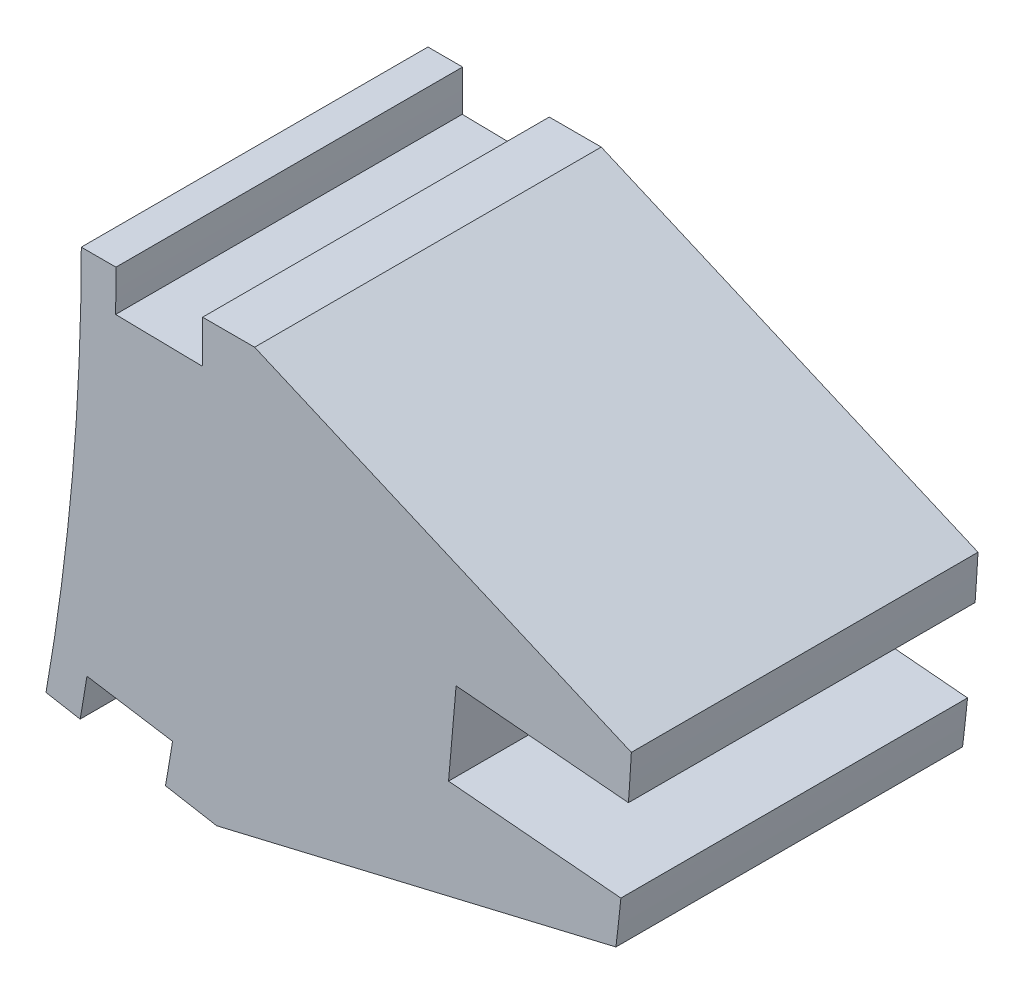
ISO-10303-21;
HEADER;
FILE_DESCRIPTION(('STEP AP214'),'2;1');
FILE_NAME('part.step','',(''),(''),'','','');
FILE_SCHEMA(('AUTOMOTIVE_DESIGN { 1 0 10303 214 1 1 1 1 }'));
ENDSEC;
DATA;
#1=APPLICATION_CONTEXT('core data for automotive mechanical design processes');
#2=APPLICATION_PROTOCOL_DEFINITION('international standard','automotive_design',2000,#1);
#3=PRODUCT_CONTEXT('',#1,'mechanical');
#4=PRODUCT('Part','Part','',(#3));
#5=PRODUCT_RELATED_PRODUCT_CATEGORY('part','',(#4));
#6=PRODUCT_DEFINITION_FORMATION('','',#4);
#7=PRODUCT_DEFINITION_CONTEXT('part definition',#1,'design');
#8=PRODUCT_DEFINITION('design','',#6,#7);
#9=PRODUCT_DEFINITION_SHAPE('','',#8);
#10=(LENGTH_UNIT() NAMED_UNIT(*) SI_UNIT(.MILLI.,.METRE.));
#11=(NAMED_UNIT(*) PLANE_ANGLE_UNIT() SI_UNIT($,.RADIAN.));
#12=(NAMED_UNIT(*) SI_UNIT($,.STERADIAN.) SOLID_ANGLE_UNIT());
#13=UNCERTAINTY_MEASURE_WITH_UNIT(LENGTH_MEASURE(1.E-05),#10,'distance_accuracy_value','');
#14=(GEOMETRIC_REPRESENTATION_CONTEXT(3) GLOBAL_UNCERTAINTY_ASSIGNED_CONTEXT((#13)) GLOBAL_UNIT_ASSIGNED_CONTEXT((#10,
#11,#12)) REPRESENTATION_CONTEXT('',''));
#15=CARTESIAN_POINT('',(0.,0.,0.));
#16=DIRECTION('',(0.,0.,1.));
#17=DIRECTION('',(1.,0.,0.));
#18=AXIS2_PLACEMENT_3D('',#15,#16,#17);
#19=CARTESIAN_POINT('',(670.,0.,100.));
#20=DIRECTION('',(0.,-1.,0.));
#21=DIRECTION('',(0.,0.,-1.));
#22=AXIS2_PLACEMENT_3D('',#19,#20,#21);
#23=PLANE('',#22);
#24=DIRECTION('',(0.,0.,1.));
#25=VECTOR('',#24,1.);
#26=CARTESIAN_POINT('',(720.,0.,-0.001000000000001));
#27=LINE('',#26,#25);
#28=CARTESIAN_POINT('',(720.,0.,0.));
#29=VERTEX_POINT('',#28);
#30=CARTESIAN_POINT('',(720.,0.,100.));
#31=VERTEX_POINT('',#30);
#32=EDGE_CURVE('E161',#29,#31,#27,.T.);
#33=ORIENTED_EDGE('',*,*,#32,.F.);
#34=DIRECTION('',(-1.,0.,0.));
#35=VECTOR('',#34,1.);
#36=CARTESIAN_POINT('',(670.,0.,0.));
#37=LINE('',#36,#35);
#38=CARTESIAN_POINT('',(705.,0.,0.));
#39=VERTEX_POINT('',#38);
#40=EDGE_CURVE('E203',#29,#39,#37,.T.);
#41=ORIENTED_EDGE('',*,*,#40,.T.);
#42=DIRECTION('',(0.,0.,-1.));
#43=VECTOR('',#42,1.);
#44=CARTESIAN_POINT('',(705.,0.,100.));
#45=LINE('',#44,#43);
#46=CARTESIAN_POINT('',(705.,0.,100.));
#47=VERTEX_POINT('',#46);
#48=EDGE_CURVE('E260',#47,#39,#45,.T.);
#49=ORIENTED_EDGE('',*,*,#48,.F.);
#50=DIRECTION('',(-1.,0.,0.));
#51=VECTOR('',#50,1.);
#52=CARTESIAN_POINT('',(670.,0.,100.));
#53=LINE('',#52,#51);
#54=EDGE_CURVE('E190',#31,#47,#53,.T.);
#55=ORIENTED_EDGE('',*,*,#54,.F.);
#56=EDGE_LOOP('',(#33,#41,#49,#55));
#57=FACE_BOUND('',#56,.T.);
#58=ADVANCED_FACE('F35',(#57),#23,.F.);
#59=CARTESIAN_POINT('',(0.,0.,100.));
#60=DIRECTION('',(0.,0.,-1.));
#61=DIRECTION('',(-1.,0.,0.));
#62=AXIS2_PLACEMENT_3D('',#59,#60,#61);
#63=CYLINDRICAL_SURFACE('',#62,830.);
#64=DIRECTION('',(0.,0.,1.));
#65=VECTOR('',#64,1.);
#66=CARTESIAN_POINT('',(828.675083599336,-46.8786286236421,-0.001000000000001));
#67=LINE('',#66,#65);
#68=CARTESIAN_POINT('',(828.675083599336,-46.8786286236421,0.));
#69=VERTEX_POINT('',#68);
#70=CARTESIAN_POINT('',(828.675083599336,-46.8786286236421,100.));
#71=VERTEX_POINT('',#70);
#72=EDGE_CURVE('E50',#69,#71,#67,.T.);
#73=ORIENTED_EDGE('',*,*,#72,.T.);
#74=CARTESIAN_POINT('',(0.,0.,100.));
#75=DIRECTION('',(0.,0.,1.));
#76=DIRECTION('',(1.,0.,0.));
#77=AXIS2_PLACEMENT_3D('',#74,#75,#76);
#78=CIRCLE('',#77,830.);
#79=CARTESIAN_POINT('',(827.837272556722,-59.8786286236421,100.));
#80=VERTEX_POINT('',#79);
#81=EDGE_CURVE('E172',#80,#71,#78,.T.);
#82=ORIENTED_EDGE('',*,*,#81,.F.);
#83=DIRECTION('',(0.,0.,1.));
#84=VECTOR('',#83,1.);
#85=CARTESIAN_POINT('',(827.837272556722,-59.8786286236421,0.));
#86=LINE('',#85,#84);
#87=CARTESIAN_POINT('',(827.837272556722,-59.8786286236421,0.));
#88=VERTEX_POINT('',#87);
#89=EDGE_CURVE('E236',#88,#80,#86,.T.);
#90=ORIENTED_EDGE('',*,*,#89,.F.);
#91=CARTESIAN_POINT('',(0.,0.,0.));
#92=DIRECTION('',(0.,0.,1.));
#93=DIRECTION('',(1.,0.,0.));
#94=AXIS2_PLACEMENT_3D('',#91,#92,#93);
#95=CIRCLE('',#94,830.);
#96=EDGE_CURVE('E174',#88,#69,#95,.T.);
#97=ORIENTED_EDGE('',*,*,#96,.T.);
#98=EDGE_LOOP('',(#73,#82,#90,#97));
#99=FACE_BOUND('',#98,.T.);
#100=ADVANCED_FACE('F170',(#99),#63,.T.);
#101=CARTESIAN_POINT('',(0.,0.,100.));
#102=DIRECTION('',(0.,0.,1.));
#103=DIRECTION('',(1.,0.,0.));
#104=AXIS2_PLACEMENT_3D('',#101,#102,#103);
#105=PLANE('',#104);
#106=ORIENTED_EDGE('',*,*,#81,.T.);
#107=DIRECTION('',(-0.918213730200936,0.396085275755718,0.));
#108=VECTOR('',#107,1.);
#109=CARTESIAN_POINT('',(112.956152882748,261.857475741113,100.));
#110=LINE('',#109,#108);
#111=EDGE_CURVE('E158',#71,#31,#110,.T.);
#112=ORIENTED_EDGE('',*,*,#111,.T.);
#113=ORIENTED_EDGE('',*,*,#54,.T.);
#114=CARTESIAN_POINT('',(0.,0.,100.));
#115=DIRECTION('',(0.,0.,-1.));
#116=DIRECTION('',(-1.,0.,0.));
#117=AXIS2_PLACEMENT_3D('',#114,#115,#116);
#118=CIRCLE('',#117,705.);
#119=CARTESIAN_POINT('',(704.892625085256,-12.3039465382994,100.));
#120=VERTEX_POINT('',#119);
#121=EDGE_CURVE('E257',#120,#47,#118,.F.);
#122=ORIENTED_EDGE('',*,*,#121,.F.);
#123=DIRECTION('',(0.999847695156391,-0.0174524064373041,0.));
#124=VECTOR('',#123,1.);
#125=CARTESIAN_POINT('',(0.,0.,100.));
#126=LINE('',#125,#124);
#127=CARTESIAN_POINT('',(679.896432706346,-11.8676363773668,100.));
#128=VERTEX_POINT('',#127);
#129=EDGE_CURVE('E270',#128,#120,#126,.T.);
#130=ORIENTED_EDGE('',*,*,#129,.F.);
#131=CARTESIAN_POINT('',(0.,0.,100.));
#132=DIRECTION('',(0.,0.,-1.));
#133=DIRECTION('',(-1.,0.,0.));
#134=AXIS2_PLACEMENT_3D('',#131,#132,#133);
#135=CIRCLE('',#134,680.);
#136=CARTESIAN_POINT('',(680.,0.,100.));
#137=VERTEX_POINT('',#136);
#138=EDGE_CURVE('E278',#128,#137,#135,.F.);
#139=ORIENTED_EDGE('',*,*,#138,.T.);
#140=CARTESIAN_POINT('',(670.,0.,100.));
#141=VERTEX_POINT('',#140);
#142=EDGE_CURVE('E184',#137,#141,#53,.T.);
#143=ORIENTED_EDGE('',*,*,#142,.T.);
#144=CARTESIAN_POINT('',(0.,0.,100.));
#145=DIRECTION('',(0.,0.,-1.));
#146=DIRECTION('',(1.,0.,0.));
#147=AXIS2_PLACEMENT_3D('',#144,#145,#146);
#148=CIRCLE('',#147,670.);
#149=CARTESIAN_POINT('',(659.821194518179,-116.344279036844,100.));
#150=VERTEX_POINT('',#149);
#151=EDGE_CURVE('E204',#141,#150,#148,.T.);
#152=ORIENTED_EDGE('',*,*,#151,.T.);
#153=DIRECTION('',(0.984807753012208,-0.173648177666931,0.));
#154=VECTOR('',#153,1.);
#155=CARTESIAN_POINT('',(659.821194518179,-116.344279036844,100.));
#156=LINE('',#155,#154);
#157=CARTESIAN_POINT('',(669.669272048302,-118.080760813513,100.));
#158=VERTEX_POINT('',#157);
#159=EDGE_CURVE('E182',#150,#158,#156,.T.);
#160=ORIENTED_EDGE('',*,*,#159,.T.);
#161=CARTESIAN_POINT('',(0.,0.,100.));
#162=DIRECTION('',(0.,0.,-1.));
#163=DIRECTION('',(-1.,0.,0.));
#164=AXIS2_PLACEMENT_3D('',#161,#162,#163);
#165=CIRCLE('',#164,680.);
#166=CARTESIAN_POINT('',(671.628071604693,-106.375436227344,100.));
#167=VERTEX_POINT('',#166);
#168=EDGE_CURVE('E284',#167,#158,#165,.T.);
#169=ORIENTED_EDGE('',*,*,#168,.F.);
#170=DIRECTION('',(0.987688340595141,-0.156434465040212,0.));
#171=VECTOR('',#170,1.);
#172=CARTESIAN_POINT('',(0.,0.,100.));
#173=LINE('',#172,#171);
#174=CARTESIAN_POINT('',(696.320280119572,-110.286297853349,100.));
#175=VERTEX_POINT('',#174);
#176=EDGE_CURVE('E290',#167,#175,#173,.T.);
#177=ORIENTED_EDGE('',*,*,#176,.T.);
#178=CARTESIAN_POINT('',(0.,0.,100.));
#179=DIRECTION('',(0.,0.,-1.));
#180=DIRECTION('',(-1.,0.,0.));
#181=AXIS2_PLACEMENT_3D('',#178,#179,#180);
#182=CIRCLE('',#181,705.);
#183=CARTESIAN_POINT('',(694.289465873607,-122.421965255186,100.));
#184=VERTEX_POINT('',#183);
#185=EDGE_CURVE('E296',#175,#184,#182,.T.);
#186=ORIENTED_EDGE('',*,*,#185,.T.);
#187=CARTESIAN_POINT('',(709.06158216879,-125.02668792019,100.));
#188=VERTEX_POINT('',#187);
#189=EDGE_CURVE('E186',#184,#188,#156,.T.);
#190=ORIENTED_EDGE('',*,*,#189,.T.);
#191=DIRECTION('',(-0.973043486759826,-0.230621709460062,0.));
#192=VECTOR('',#191,1.);
#193=CARTESIAN_POINT('',(65.7690216384555,-277.493902398411,100.));
#194=LINE('',#193,#192);
#195=CARTESIAN_POINT('',(824.226035488686,-97.7314812258738,100.));
#196=VERTEX_POINT('',#195);
#197=EDGE_CURVE('E305',#196,#188,#194,.T.);
#198=ORIENTED_EDGE('',*,*,#197,.F.);
#199=CARTESIAN_POINT('',(825.65837898803,-84.7834960759358,100.));
#200=VERTEX_POINT('',#199);
#201=EDGE_CURVE('E181',#196,#200,#78,.T.);
#202=ORIENTED_EDGE('',*,*,#201,.T.);
#203=DIRECTION('',(0.996194698091746,-0.0871557427476585,0.));
#204=VECTOR('',#203,1.);
#205=CARTESIAN_POINT('',(-1.08944678434574,-12.4524337261469,100.));
#206=LINE('',#205,#204);
#207=CARTESIAN_POINT('',(775.942417727216,-80.4339130693205,100.));
#208=VERTEX_POINT('',#207);
#209=EDGE_CURVE('E241',#208,#200,#206,.T.);
#210=ORIENTED_EDGE('',*,*,#209,.F.);
#211=DIRECTION('',(-0.0871557427476599,-0.996194698091746,0.));
#212=VECTOR('',#211,1.);
#213=CARTESIAN_POINT('',(777.031864511561,-67.9814793431747,100.));
#214=LINE('',#213,#212);
#215=CARTESIAN_POINT('',(778.121311295907,-55.5290456170269,100.));
#216=VERTEX_POINT('',#215);
#217=EDGE_CURVE('E244',#216,#208,#214,.T.);
#218=ORIENTED_EDGE('',*,*,#217,.F.);
#219=DIRECTION('',(0.996194698091746,-0.0871557427476581,0.));
#220=VECTOR('',#219,1.);
#221=CARTESIAN_POINT('',(1.08944678434569,12.4524337261465,100.));
#222=LINE('',#221,#220);
#223=EDGE_CURVE('E180',#216,#80,#222,.T.);
#224=ORIENTED_EDGE('',*,*,#223,.T.);
#225=EDGE_LOOP('',(#106,#112,#113,#122,#130,#139,#143,#152,#160,#169,#177,#186,#190,#198,#202,
#210,#218,#224));
#226=FACE_BOUND('',#225,.T.);
#227=ADVANCED_FACE('F177',(#226),#105,.T.);
#228=CARTESIAN_POINT('',(0.,0.,0.));
#229=DIRECTION('',(0.,0.,1.));
#230=DIRECTION('',(1.,0.,0.));
#231=AXIS2_PLACEMENT_3D('',#228,#229,#230);
#232=PLANE('',#231);
#233=DIRECTION('',(0.918213730200936,-0.396085275755718,0.));
#234=VECTOR('',#233,1.);
#235=CARTESIAN_POINT('',(112.956152882748,261.857475741113,0.));
#236=LINE('',#235,#234);
#237=EDGE_CURVE('E165',#29,#69,#236,.T.);
#238=ORIENTED_EDGE('',*,*,#237,.T.);
#239=ORIENTED_EDGE('',*,*,#96,.F.);
#240=DIRECTION('',(0.996194698091746,-0.0871557427476581,0.));
#241=VECTOR('',#240,1.);
#242=CARTESIAN_POINT('',(1.08944678434569,12.4524337261465,0.));
#243=LINE('',#242,#241);
#244=CARTESIAN_POINT('',(778.121311295907,-55.5290456170269,0.));
#245=VERTEX_POINT('',#244);
#246=EDGE_CURVE('E233',#245,#88,#243,.T.);
#247=ORIENTED_EDGE('',*,*,#246,.F.);
#248=DIRECTION('',(-0.0871557427476599,-0.996194698091746,0.));
#249=VECTOR('',#248,1.);
#250=CARTESIAN_POINT('',(777.031864511561,-67.9814793431747,0.));
#251=LINE('',#250,#249);
#252=CARTESIAN_POINT('',(775.942417727216,-80.4339130693205,0.));
#253=VERTEX_POINT('',#252);
#254=EDGE_CURVE('E240',#245,#253,#251,.T.);
#255=ORIENTED_EDGE('',*,*,#254,.T.);
#256=DIRECTION('',(0.996194698091746,-0.0871557427476585,0.));
#257=VECTOR('',#256,1.);
#258=CARTESIAN_POINT('',(-1.08944678434574,-12.4524337261469,0.));
#259=LINE('',#258,#257);
#260=CARTESIAN_POINT('',(825.65837898803,-84.7834960759358,0.));
#261=VERTEX_POINT('',#260);
#262=EDGE_CURVE('E249',#253,#261,#259,.T.);
#263=ORIENTED_EDGE('',*,*,#262,.T.);
#264=CARTESIAN_POINT('',(824.226035488686,-97.7314812258738,0.));
#265=VERTEX_POINT('',#264);
#266=EDGE_CURVE('E200',#265,#261,#95,.T.);
#267=ORIENTED_EDGE('',*,*,#266,.F.);
#268=DIRECTION('',(0.973043486759826,0.230621709460062,0.));
#269=VECTOR('',#268,1.);
#270=CARTESIAN_POINT('',(65.7690216384555,-277.493902398411,0.));
#271=LINE('',#270,#269);
#272=CARTESIAN_POINT('',(709.06158216879,-125.02668792019,0.));
#273=VERTEX_POINT('',#272);
#274=EDGE_CURVE('E58',#273,#265,#271,.T.);
#275=ORIENTED_EDGE('',*,*,#274,.F.);
#276=DIRECTION('',(0.984807753012208,-0.173648177666931,0.));
#277=VECTOR('',#276,1.);
#278=CARTESIAN_POINT('',(659.821194518179,-116.344279036844,0.));
#279=LINE('',#278,#277);
#280=CARTESIAN_POINT('',(694.289465873607,-122.421965255186,0.));
#281=VERTEX_POINT('',#280);
#282=EDGE_CURVE('E195',#281,#273,#279,.T.);
#283=ORIENTED_EDGE('',*,*,#282,.F.);
#284=CARTESIAN_POINT('',(0.,0.,0.));
#285=DIRECTION('',(0.,0.,-1.));
#286=DIRECTION('',(-1.,0.,0.));
#287=AXIS2_PLACEMENT_3D('',#284,#285,#286);
#288=CIRCLE('',#287,705.);
#289=CARTESIAN_POINT('',(696.320280119572,-110.286297853349,0.));
#290=VERTEX_POINT('',#289);
#291=EDGE_CURVE('E291',#290,#281,#288,.T.);
#292=ORIENTED_EDGE('',*,*,#291,.F.);
#293=DIRECTION('',(0.987688340595141,-0.156434465040212,0.));
#294=VECTOR('',#293,1.);
#295=CARTESIAN_POINT('',(0.,0.,0.));
#296=LINE('',#295,#294);
#297=CARTESIAN_POINT('',(671.628071604693,-106.375436227344,0.));
#298=VERTEX_POINT('',#297);
#299=EDGE_CURVE('E266',#298,#290,#296,.T.);
#300=ORIENTED_EDGE('',*,*,#299,.F.);
#301=CARTESIAN_POINT('',(0.,0.,0.));
#302=DIRECTION('',(0.,0.,-1.));
#303=DIRECTION('',(-1.,0.,0.));
#304=AXIS2_PLACEMENT_3D('',#301,#302,#303);
#305=CIRCLE('',#304,680.);
#306=CARTESIAN_POINT('',(669.669272048302,-118.080760813513,0.));
#307=VERTEX_POINT('',#306);
#308=EDGE_CURVE('E221',#298,#307,#305,.T.);
#309=ORIENTED_EDGE('',*,*,#308,.T.);
#310=CARTESIAN_POINT('',(659.821194518179,-116.344279036844,0.));
#311=VERTEX_POINT('',#310);
#312=EDGE_CURVE('E197',#311,#307,#279,.T.);
#313=ORIENTED_EDGE('',*,*,#312,.F.);
#314=CARTESIAN_POINT('',(0.,0.,0.));
#315=DIRECTION('',(0.,0.,-1.));
#316=DIRECTION('',(1.,0.,0.));
#317=AXIS2_PLACEMENT_3D('',#314,#315,#316);
#318=CIRCLE('',#317,670.);
#319=CARTESIAN_POINT('',(670.,0.,0.));
#320=VERTEX_POINT('',#319);
#321=EDGE_CURVE('E192',#320,#311,#318,.T.);
#322=ORIENTED_EDGE('',*,*,#321,.F.);
#323=CARTESIAN_POINT('',(680.,0.,0.));
#324=VERTEX_POINT('',#323);
#325=EDGE_CURVE('E202',#324,#320,#37,.T.);
#326=ORIENTED_EDGE('',*,*,#325,.F.);
#327=CARTESIAN_POINT('',(0.,0.,0.));
#328=DIRECTION('',(0.,0.,-1.));
#329=DIRECTION('',(-1.,0.,0.));
#330=AXIS2_PLACEMENT_3D('',#327,#328,#329);
#331=CIRCLE('',#330,680.);
#332=CARTESIAN_POINT('',(679.896432706346,-11.8676363773668,0.));
#333=VERTEX_POINT('',#332);
#334=EDGE_CURVE('E271',#333,#324,#331,.F.);
#335=ORIENTED_EDGE('',*,*,#334,.F.);
#336=DIRECTION('',(0.999847695156391,-0.0174524064373041,0.));
#337=VECTOR('',#336,1.);
#338=CARTESIAN_POINT('',(0.,0.,0.));
#339=LINE('',#338,#337);
#340=CARTESIAN_POINT('',(704.892625085256,-12.3039465382994,0.));
#341=VERTEX_POINT('',#340);
#342=EDGE_CURVE('E273',#333,#341,#339,.T.);
#343=ORIENTED_EDGE('',*,*,#342,.T.);
#344=CARTESIAN_POINT('',(0.,0.,0.));
#345=DIRECTION('',(0.,0.,-1.));
#346=DIRECTION('',(-1.,0.,0.));
#347=AXIS2_PLACEMENT_3D('',#344,#345,#346);
#348=CIRCLE('',#347,705.);
#349=EDGE_CURVE('E267',#341,#39,#348,.F.);
#350=ORIENTED_EDGE('',*,*,#349,.T.);
#351=ORIENTED_EDGE('',*,*,#40,.F.);
#352=EDGE_LOOP('',(#238,#239,#247,#255,#263,#267,#275,#283,#292,#300,#309,#313,#322,#326,#335,
#343,#350,#351));
#353=FACE_BOUND('',#352,.T.);
#354=ADVANCED_FACE('F216',(#353),#232,.F.);
#355=CARTESIAN_POINT('',(659.821194518179,-116.344279036844,100.));
#356=DIRECTION('',(0.173648177666931,0.984807753012208,0.));
#357=DIRECTION('',(-0.984807753012208,0.173648177666931,0.));
#358=AXIS2_PLACEMENT_3D('',#355,#356,#357);
#359=PLANE('',#358);
#360=DIRECTION('',(0.,0.,-1.));
#361=VECTOR('',#360,1.);
#362=CARTESIAN_POINT('',(669.669272048302,-118.080760813513,100.));
#363=LINE('',#362,#361);
#364=EDGE_CURVE('E225',#158,#307,#363,.T.);
#365=ORIENTED_EDGE('',*,*,#364,.F.);
#366=ORIENTED_EDGE('',*,*,#159,.F.);
#367=DIRECTION('',(0.,0.,-1.));
#368=VECTOR('',#367,1.);
#369=CARTESIAN_POINT('',(659.821194518179,-116.344279036844,100.));
#370=LINE('',#369,#368);
#371=EDGE_CURVE('E11',#150,#311,#370,.T.);
#372=ORIENTED_EDGE('',*,*,#371,.T.);
#373=ORIENTED_EDGE('',*,*,#312,.T.);
#374=EDGE_LOOP('',(#365,#366,#372,#373));
#375=FACE_BOUND('',#374,.T.);
#376=ADVANCED_FACE('F224',(#375),#359,.F.);
#377=CARTESIAN_POINT('',(0.,0.,100.));
#378=DIRECTION('',(0.,0.,-1.));
#379=DIRECTION('',(-1.,0.,0.));
#380=AXIS2_PLACEMENT_3D('',#377,#378,#379);
#381=CYLINDRICAL_SURFACE('',#380,670.);
#382=ORIENTED_EDGE('',*,*,#321,.T.);
#383=ORIENTED_EDGE('',*,*,#371,.F.);
#384=ORIENTED_EDGE('',*,*,#151,.F.);
#385=DIRECTION('',(0.,0.,-1.));
#386=VECTOR('',#385,1.);
#387=CARTESIAN_POINT('',(670.,0.,100.));
#388=LINE('',#387,#386);
#389=EDGE_CURVE('E43',#141,#320,#388,.T.);
#390=ORIENTED_EDGE('',*,*,#389,.T.);
#391=EDGE_LOOP('',(#382,#383,#384,#390));
#392=FACE_BOUND('',#391,.T.);
#393=ADVANCED_FACE('F37',(#392),#381,.F.);
#394=ORIENTED_EDGE('',*,*,#282,.T.);
#395=DIRECTION('',(0.,0.,1.));
#396=VECTOR('',#395,1.);
#397=CARTESIAN_POINT('',(709.06158216879,-125.02668792019,-0.001000000000001));
#398=LINE('',#397,#396);
#399=EDGE_CURVE('E302',#273,#188,#398,.T.);
#400=ORIENTED_EDGE('',*,*,#399,.T.);
#401=ORIENTED_EDGE('',*,*,#189,.F.);
#402=DIRECTION('',(0.,0.,-1.));
#403=VECTOR('',#402,1.);
#404=CARTESIAN_POINT('',(694.289465873607,-122.421965255186,100.));
#405=LINE('',#404,#403);
#406=EDGE_CURVE('E283',#184,#281,#405,.T.);
#407=ORIENTED_EDGE('',*,*,#406,.T.);
#408=EDGE_LOOP('',(#394,#400,#401,#407));
#409=FACE_BOUND('',#408,.T.);
#410=ADVANCED_FACE('F337',(#409),#359,.F.);
#411=ORIENTED_EDGE('',*,*,#201,.F.);
#412=DIRECTION('',(0.,0.,1.));
#413=VECTOR('',#412,1.);
#414=CARTESIAN_POINT('',(824.226035488686,-97.7314812258738,-0.001000000000001));
#415=LINE('',#414,#413);
#416=EDGE_CURVE('E303',#265,#196,#415,.T.);
#417=ORIENTED_EDGE('',*,*,#416,.F.);
#418=ORIENTED_EDGE('',*,*,#266,.T.);
#419=DIRECTION('',(0.,0.,1.));
#420=VECTOR('',#419,1.);
#421=CARTESIAN_POINT('',(825.65837898803,-84.7834960759358,0.));
#422=LINE('',#421,#420);
#423=EDGE_CURVE('E232',#261,#200,#422,.T.);
#424=ORIENTED_EDGE('',*,*,#423,.T.);
#425=EDGE_LOOP('',(#411,#417,#418,#424));
#426=FACE_BOUND('',#425,.T.);
#427=ADVANCED_FACE('F328',(#426),#63,.T.);
#428=ORIENTED_EDGE('',*,*,#142,.F.);
#429=DIRECTION('',(0.,0.,-1.));
#430=VECTOR('',#429,1.);
#431=CARTESIAN_POINT('',(680.,0.,100.));
#432=LINE('',#431,#430);
#433=EDGE_CURVE('E256',#137,#324,#432,.T.);
#434=ORIENTED_EDGE('',*,*,#433,.T.);
#435=ORIENTED_EDGE('',*,*,#325,.T.);
#436=ORIENTED_EDGE('',*,*,#389,.F.);
#437=EDGE_LOOP('',(#428,#434,#435,#436));
#438=FACE_BOUND('',#437,.T.);
#439=ADVANCED_FACE('F325',(#438),#23,.F.);
#440=CARTESIAN_POINT('',(777.031864511561,-67.9814793431747,0.));
#441=DIRECTION('',(-0.996194698091745,0.0871557427476599,0.));
#442=DIRECTION('',(-0.0871557427476599,-0.996194698091746,0.));
#443=AXIS2_PLACEMENT_3D('',#440,#441,#442);
#444=PLANE('',#443);
#445=ORIENTED_EDGE('',*,*,#217,.T.);
#446=DIRECTION('',(0.,0.,1.));
#447=VECTOR('',#446,1.);
#448=CARTESIAN_POINT('',(775.942417727216,-80.4339130693205,0.));
#449=LINE('',#448,#447);
#450=EDGE_CURVE('E230',#253,#208,#449,.T.);
#451=ORIENTED_EDGE('',*,*,#450,.F.);
#452=ORIENTED_EDGE('',*,*,#254,.F.);
#453=DIRECTION('',(0.,0.,1.));
#454=VECTOR('',#453,1.);
#455=CARTESIAN_POINT('',(778.121311295907,-55.5290456170269,0.));
#456=LINE('',#455,#454);
#457=EDGE_CURVE('E196',#245,#216,#456,.T.);
#458=ORIENTED_EDGE('',*,*,#457,.T.);
#459=EDGE_LOOP('',(#445,#451,#452,#458));
#460=FACE_BOUND('',#459,.T.);
#461=ADVANCED_FACE('F327',(#460),#444,.F.);
#462=CARTESIAN_POINT('',(1.08944678434569,12.4524337261465,0.));
#463=DIRECTION('',(-0.0871557427476581,-0.996194698091745,0.));
#464=DIRECTION('',(0.996194698091746,-0.0871557427476581,0.));
#465=AXIS2_PLACEMENT_3D('',#462,#463,#464);
#466=PLANE('',#465);
#467=ORIENTED_EDGE('',*,*,#223,.F.);
#468=ORIENTED_EDGE('',*,*,#457,.F.);
#469=ORIENTED_EDGE('',*,*,#246,.T.);
#470=ORIENTED_EDGE('',*,*,#89,.T.);
#471=EDGE_LOOP('',(#467,#468,#469,#470));
#472=FACE_BOUND('',#471,.T.);
#473=ADVANCED_FACE('F334',(#472),#466,.T.);
#474=CARTESIAN_POINT('',(-1.08944678434574,-12.4524337261469,0.));
#475=DIRECTION('',(-0.0871557427476584,-0.996194698091745,0.));
#476=DIRECTION('',(0.996194698091746,-0.0871557427476584,0.));
#477=AXIS2_PLACEMENT_3D('',#474,#475,#476);
#478=PLANE('',#477);
#479=ORIENTED_EDGE('',*,*,#209,.T.);
#480=ORIENTED_EDGE('',*,*,#423,.F.);
#481=ORIENTED_EDGE('',*,*,#262,.F.);
#482=ORIENTED_EDGE('',*,*,#450,.T.);
#483=EDGE_LOOP('',(#479,#480,#481,#482));
#484=FACE_BOUND('',#483,.T.);
#485=ADVANCED_FACE('F362',(#484),#478,.F.);
#486=CARTESIAN_POINT('',(0.,0.,100.));
#487=DIRECTION('',(0.0174524064373041,0.999847695156391,0.));
#488=DIRECTION('',(-0.999847695156391,0.0174524064373041,0.));
#489=AXIS2_PLACEMENT_3D('',#486,#487,#488);
#490=PLANE('',#489);
#491=ORIENTED_EDGE('',*,*,#342,.F.);
#492=DIRECTION('',(0.,0.,-1.));
#493=VECTOR('',#492,1.);
#494=CARTESIAN_POINT('',(679.896432706346,-11.8676363773668,100.));
#495=LINE('',#494,#493);
#496=EDGE_CURVE('E254',#128,#333,#495,.T.);
#497=ORIENTED_EDGE('',*,*,#496,.F.);
#498=ORIENTED_EDGE('',*,*,#129,.T.);
#499=DIRECTION('',(0.,0.,-1.));
#500=VECTOR('',#499,1.);
#501=CARTESIAN_POINT('',(704.892625085256,-12.3039465382994,100.));
#502=LINE('',#501,#500);
#503=EDGE_CURVE('E263',#120,#341,#502,.T.);
#504=ORIENTED_EDGE('',*,*,#503,.T.);
#505=EDGE_LOOP('',(#491,#497,#498,#504));
#506=FACE_BOUND('',#505,.T.);
#507=ADVANCED_FACE('F321',(#506),#490,.T.);
#508=CARTESIAN_POINT('',(0.,0.,100.));
#509=DIRECTION('',(0.,0.,-1.));
#510=DIRECTION('',(-1.,0.,0.));
#511=AXIS2_PLACEMENT_3D('',#508,#509,#510);
#512=CYLINDRICAL_SURFACE('',#511,705.);
#513=ORIENTED_EDGE('',*,*,#349,.F.);
#514=ORIENTED_EDGE('',*,*,#503,.F.);
#515=ORIENTED_EDGE('',*,*,#121,.T.);
#516=ORIENTED_EDGE('',*,*,#48,.T.);
#517=EDGE_LOOP('',(#513,#514,#515,#516));
#518=FACE_BOUND('',#517,.T.);
#519=ADVANCED_FACE('F318',(#518),#512,.F.);
#520=CARTESIAN_POINT('',(0.,0.,100.));
#521=DIRECTION('',(0.,0.,-1.));
#522=DIRECTION('',(-1.,0.,0.));
#523=AXIS2_PLACEMENT_3D('',#520,#521,#522);
#524=CYLINDRICAL_SURFACE('',#523,680.);
#525=ORIENTED_EDGE('',*,*,#334,.T.);
#526=ORIENTED_EDGE('',*,*,#433,.F.);
#527=ORIENTED_EDGE('',*,*,#138,.F.);
#528=ORIENTED_EDGE('',*,*,#496,.T.);
#529=EDGE_LOOP('',(#525,#526,#527,#528));
#530=FACE_BOUND('',#529,.T.);
#531=ADVANCED_FACE('F323',(#530),#524,.T.);
#532=CARTESIAN_POINT('',(0.,0.,100.));
#533=DIRECTION('',(0.156434465040212,0.987688340595141,0.));
#534=DIRECTION('',(-0.987688340595141,0.156434465040212,0.));
#535=AXIS2_PLACEMENT_3D('',#532,#533,#534);
#536=PLANE('',#535);
#537=ORIENTED_EDGE('',*,*,#299,.T.);
#538=DIRECTION('',(0.,0.,-1.));
#539=VECTOR('',#538,1.);
#540=CARTESIAN_POINT('',(696.320280119572,-110.286297853349,100.));
#541=LINE('',#540,#539);
#542=EDGE_CURVE('E281',#175,#290,#541,.T.);
#543=ORIENTED_EDGE('',*,*,#542,.F.);
#544=ORIENTED_EDGE('',*,*,#176,.F.);
#545=DIRECTION('',(0.,0.,-1.));
#546=VECTOR('',#545,1.);
#547=CARTESIAN_POINT('',(671.628071604693,-106.375436227344,100.));
#548=LINE('',#547,#546);
#549=EDGE_CURVE('E247',#167,#298,#548,.T.);
#550=ORIENTED_EDGE('',*,*,#549,.T.);
#551=EDGE_LOOP('',(#537,#543,#544,#550));
#552=FACE_BOUND('',#551,.T.);
#553=ADVANCED_FACE('F373',(#552),#536,.F.);
#554=CARTESIAN_POINT('',(0.,0.,100.));
#555=DIRECTION('',(0.,0.,-1.));
#556=DIRECTION('',(-1.,0.,0.));
#557=AXIS2_PLACEMENT_3D('',#554,#555,#556);
#558=CYLINDRICAL_SURFACE('',#557,680.);
#559=ORIENTED_EDGE('',*,*,#308,.F.);
#560=ORIENTED_EDGE('',*,*,#549,.F.);
#561=ORIENTED_EDGE('',*,*,#168,.T.);
#562=ORIENTED_EDGE('',*,*,#364,.T.);
#563=EDGE_LOOP('',(#559,#560,#561,#562));
#564=FACE_BOUND('',#563,.T.);
#565=ADVANCED_FACE('F378',(#564),#558,.T.);
#566=CARTESIAN_POINT('',(0.,0.,100.));
#567=DIRECTION('',(0.,0.,-1.));
#568=DIRECTION('',(-1.,0.,0.));
#569=AXIS2_PLACEMENT_3D('',#566,#567,#568);
#570=CYLINDRICAL_SURFACE('',#569,705.);
#571=ORIENTED_EDGE('',*,*,#291,.T.);
#572=ORIENTED_EDGE('',*,*,#406,.F.);
#573=ORIENTED_EDGE('',*,*,#185,.F.);
#574=ORIENTED_EDGE('',*,*,#542,.T.);
#575=EDGE_LOOP('',(#571,#572,#573,#574));
#576=FACE_BOUND('',#575,.T.);
#577=ADVANCED_FACE('F380',(#576),#570,.F.);
#578=CARTESIAN_POINT('',(65.7690216384555,-277.493902398411,-0.001000000000001));
#579=DIRECTION('',(-0.230621709460062,0.973043486759826,0.));
#580=DIRECTION('',(-0.973043486759826,-0.230621709460062,0.));
#581=AXIS2_PLACEMENT_3D('',#578,#579,#580);
#582=PLANE('',#581);
#583=ORIENTED_EDGE('',*,*,#274,.T.);
#584=ORIENTED_EDGE('',*,*,#416,.T.);
#585=ORIENTED_EDGE('',*,*,#197,.T.);
#586=ORIENTED_EDGE('',*,*,#399,.F.);
#587=EDGE_LOOP('',(#583,#584,#585,#586));
#588=FACE_BOUND('',#587,.T.);
#589=ADVANCED_FACE('F383',(#588),#582,.F.);
#590=CARTESIAN_POINT('',(112.956152882748,261.857475741113,-0.001000000000001));
#591=DIRECTION('',(0.396085275755718,0.918213730200936,0.));
#592=DIRECTION('',(-0.918213730200936,0.396085275755718,0.));
#593=AXIS2_PLACEMENT_3D('',#590,#591,#592);
#594=PLANE('',#593);
#595=ORIENTED_EDGE('',*,*,#32,.T.);
#596=ORIENTED_EDGE('',*,*,#111,.F.);
#597=ORIENTED_EDGE('',*,*,#72,.F.);
#598=ORIENTED_EDGE('',*,*,#237,.F.);
#599=EDGE_LOOP('',(#595,#596,#597,#598));
#600=FACE_BOUND('',#599,.T.);
#601=ADVANCED_FACE('F159',(#600),#594,.T.);
#602=CLOSED_SHELL('',(#58,#100,#227,#354,#376,#393,#410,#427,#439,#461,#473,#485,#507,#519,#531,
#553,#565,#577,#589,#601));
#603=MANIFOLD_SOLID_BREP('B2',#602);
#604=ADVANCED_BREP_SHAPE_REPRESENTATION('',(#18,#603),#14);
#605=SHAPE_DEFINITION_REPRESENTATION(#9,#604);
ENDSEC;
END-ISO-10303-21;
